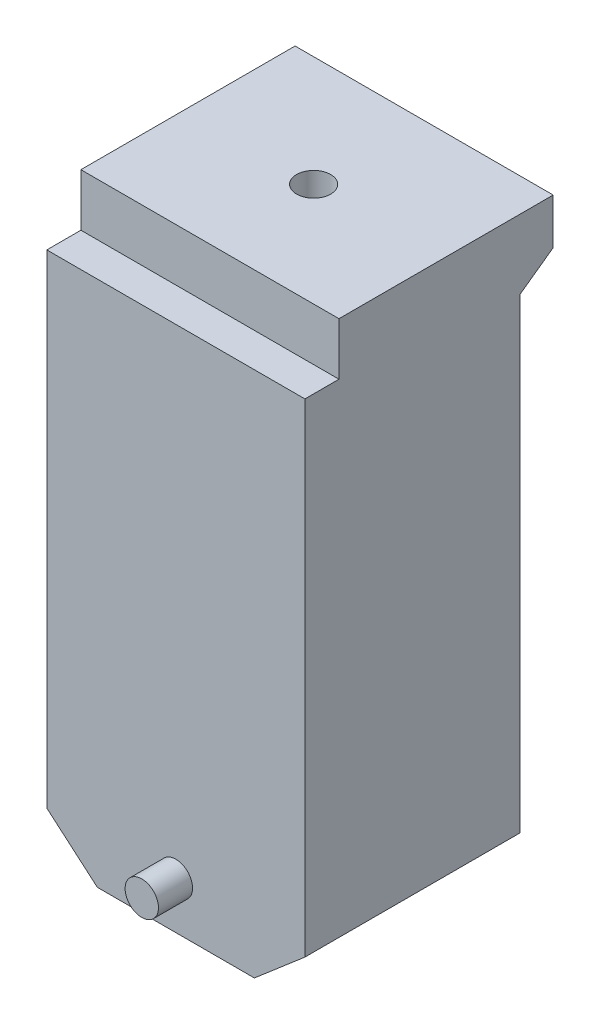
ISO-10303-21;
HEADER;
FILE_DESCRIPTION(('STEP AP214'),'2;1');
FILE_NAME('part.step','',(''),(''),'','','');
FILE_SCHEMA(('AUTOMOTIVE_DESIGN { 1 0 10303 214 1 1 1 1 }'));
ENDSEC;
DATA;
#1=APPLICATION_CONTEXT('core data for automotive mechanical design processes');
#2=APPLICATION_PROTOCOL_DEFINITION('international standard','automotive_design',2000,#1);
#3=PRODUCT_CONTEXT('',#1,'mechanical');
#4=PRODUCT('Part','Part','',(#3));
#5=PRODUCT_RELATED_PRODUCT_CATEGORY('part','',(#4));
#6=PRODUCT_DEFINITION_FORMATION('','',#4);
#7=PRODUCT_DEFINITION_CONTEXT('part definition',#1,'design');
#8=PRODUCT_DEFINITION('design','',#6,#7);
#9=PRODUCT_DEFINITION_SHAPE('','',#8);
#10=(LENGTH_UNIT() NAMED_UNIT(*) SI_UNIT(.MILLI.,.METRE.));
#11=(NAMED_UNIT(*) PLANE_ANGLE_UNIT() SI_UNIT($,.RADIAN.));
#12=(NAMED_UNIT(*) SI_UNIT($,.STERADIAN.) SOLID_ANGLE_UNIT());
#13=UNCERTAINTY_MEASURE_WITH_UNIT(LENGTH_MEASURE(1.E-05),#10,'distance_accuracy_value','');
#14=(GEOMETRIC_REPRESENTATION_CONTEXT(3) GLOBAL_UNCERTAINTY_ASSIGNED_CONTEXT((#13)) GLOBAL_UNIT_ASSIGNED_CONTEXT((#10,
#11,#12)) REPRESENTATION_CONTEXT('',''));
#15=CARTESIAN_POINT('',(0.,0.,0.));
#16=DIRECTION('',(0.,0.,1.));
#17=DIRECTION('',(1.,0.,0.));
#18=AXIS2_PLACEMENT_3D('',#15,#16,#17);
#19=CARTESIAN_POINT('',(75.75,77.1346659907948,-15.5046262952227));
#20=DIRECTION('',(0.,0.,1.));
#21=DIRECTION('',(0.,-1.,0.));
#22=AXIS2_PLACEMENT_3D('',#19,#20,#21);
#23=PLANE('',#22);
#24=CARTESIAN_POINT('',(37.875,-58.7053340092052,-15.5046262952227));
#25=DIRECTION('',(0.,0.,1.));
#26=DIRECTION('',(0.,-1.,0.));
#27=AXIS2_PLACEMENT_3D('',#24,#25,#26);
#28=CIRCLE('',#27,4.9);
#29=CARTESIAN_POINT('',(37.875,-63.6053340092052,-15.5046262952227));
#30=VERTEX_POINT('',#29);
#31=EDGE_CURVE('E192',#30,#30,#28,.T.);
#32=ORIENTED_EDGE('',*,*,#31,.T.);
#33=EDGE_LOOP('',(#32));
#34=FACE_BOUND('',#33,.T.);
#35=DIRECTION('',(0.,1.,0.));
#36=VECTOR('',#35,1.);
#37=CARTESIAN_POINT('',(75.75,77.1346659907948,-15.5046262952227));
#38=LINE('',#37,#36);
#39=CARTESIAN_POINT('',(75.75,-59.7553340092052,-15.5046262952227));
#40=VERTEX_POINT('',#39);
#41=CARTESIAN_POINT('',(75.75,77.1346659907948,-15.5046262952227));
#42=VERTEX_POINT('',#41);
#43=EDGE_CURVE('E132',#40,#42,#38,.T.);
#44=ORIENTED_EDGE('',*,*,#43,.F.);
#45=DIRECTION('',(-0.759039786358374,-0.651044240221073,0.));
#46=VECTOR('',#45,1.);
#47=CARTESIAN_POINT('',(143.396723365083,-1.7333298821753,-15.5046262952227));
#48=LINE('',#47,#46);
#49=CARTESIAN_POINT('',(60.92,-72.4753340092052,-15.5046262952227));
#50=VERTEX_POINT('',#49);
#51=EDGE_CURVE('E48',#40,#50,#48,.T.);
#52=ORIENTED_EDGE('',*,*,#51,.T.);
#53=DIRECTION('',(-1.,0.,0.));
#54=VECTOR('',#53,1.);
#55=CARTESIAN_POINT('',(75.75,-72.4753340092052,-15.5046262952227));
#56=LINE('',#55,#54);
#57=CARTESIAN_POINT('',(14.83,-72.4753340092052,-15.5046262952227));
#58=VERTEX_POINT('',#57);
#59=EDGE_CURVE('E142',#50,#58,#56,.T.);
#60=ORIENTED_EDGE('',*,*,#59,.T.);
#61=DIRECTION('',(-0.759039786358374,0.651044240221073,0.));
#62=VECTOR('',#61,1.);
#63=CARTESIAN_POINT('',(-24.0040125215042,-39.1665923184747,-15.5046262952227));
#64=LINE('',#63,#62);
#65=CARTESIAN_POINT('',(0.,-59.7553340092052,-15.5046262952227));
#66=VERTEX_POINT('',#65);
#67=EDGE_CURVE('E167',#58,#66,#64,.T.);
#68=ORIENTED_EDGE('',*,*,#67,.T.);
#69=DIRECTION('',(0.,1.,0.));
#70=VECTOR('',#69,1.);
#71=CARTESIAN_POINT('',(0.,77.1346659907948,-15.5046262952227));
#72=LINE('',#71,#70);
#73=CARTESIAN_POINT('',(0.,77.1346659907948,-15.5046262952227));
#74=VERTEX_POINT('',#73);
#75=EDGE_CURVE('E165',#66,#74,#72,.T.);
#76=ORIENTED_EDGE('',*,*,#75,.T.);
#77=DIRECTION('',(-1.,0.,0.));
#78=VECTOR('',#77,1.);
#79=CARTESIAN_POINT('',(75.75,77.1346659907948,-15.5046262952227));
#80=LINE('',#79,#78);
#81=EDGE_CURVE('E152',#42,#74,#80,.T.);
#82=ORIENTED_EDGE('',*,*,#81,.F.);
#83=EDGE_LOOP('',(#44,#52,#60,#68,#76,#82));
#84=FACE_BOUND('',#83,.T.);
#85=ADVANCED_FACE('F34',(#34,#84),#23,.F.);
#86=CARTESIAN_POINT('',(75.75,84.1346659907948,-25.2545628489426));
#87=DIRECTION('',(0.,0.812321935637408,0.583209287376578));
#88=DIRECTION('',(0.,-0.583209287376578,0.812321935637407));
#89=AXIS2_PLACEMENT_3D('',#86,#87,#88);
#90=PLANE('',#89);
#91=DIRECTION('',(0.,0.583209287376578,-0.812321935637407));
#92=VECTOR('',#91,1.);
#93=CARTESIAN_POINT('',(0.,84.1346659907948,-25.2545628489426));
#94=LINE('',#93,#92);
#95=CARTESIAN_POINT('',(0.,84.1346659907948,-25.2545628489426));
#96=VERTEX_POINT('',#95);
#97=EDGE_CURVE('E161',#74,#96,#94,.T.);
#98=ORIENTED_EDGE('',*,*,#97,.T.);
#99=DIRECTION('',(-1.,0.,0.));
#100=VECTOR('',#99,1.);
#101=CARTESIAN_POINT('',(75.75,84.1346659907948,-25.2545628489426));
#102=LINE('',#101,#100);
#103=CARTESIAN_POINT('',(75.75,84.1346659907948,-25.2545628489426));
#104=VERTEX_POINT('',#103);
#105=EDGE_CURVE('E149',#104,#96,#102,.T.);
#106=ORIENTED_EDGE('',*,*,#105,.F.);
#107=DIRECTION('',(0.,0.583209287376578,-0.812321935637407));
#108=VECTOR('',#107,1.);
#109=CARTESIAN_POINT('',(75.75,84.1346659907948,-25.2545628489426));
#110=LINE('',#109,#108);
#111=EDGE_CURVE('E135',#42,#104,#110,.T.);
#112=ORIENTED_EDGE('',*,*,#111,.F.);
#113=ORIENTED_EDGE('',*,*,#81,.T.);
#114=EDGE_LOOP('',(#98,#106,#112,#113));
#115=FACE_BOUND('',#114,.T.);
#116=ADVANCED_FACE('F158',(#115),#90,.F.);
#117=CARTESIAN_POINT('',(75.75,97.5246659907948,-25.2545628489426));
#118=DIRECTION('',(0.,0.,1.));
#119=DIRECTION('',(1.,0.,0.));
#120=AXIS2_PLACEMENT_3D('',#117,#118,#119);
#121=PLANE('',#120);
#122=DIRECTION('',(0.,1.,0.));
#123=VECTOR('',#122,1.);
#124=CARTESIAN_POINT('',(0.,97.5246659907948,-25.2545628489426));
#125=LINE('',#124,#123);
#126=CARTESIAN_POINT('',(0.,97.5246659907948,-25.2545628489426));
#127=VERTEX_POINT('',#126);
#128=EDGE_CURVE('E138',#96,#127,#125,.T.);
#129=ORIENTED_EDGE('',*,*,#128,.T.);
#130=DIRECTION('',(-1.,0.,0.));
#131=VECTOR('',#130,1.);
#132=CARTESIAN_POINT('',(75.75,97.5246659907948,-25.2545628489426));
#133=LINE('',#132,#131);
#134=CARTESIAN_POINT('',(75.75,97.5246659907948,-25.2545628489426));
#135=VERTEX_POINT('',#134);
#136=EDGE_CURVE('E146',#135,#127,#133,.T.);
#137=ORIENTED_EDGE('',*,*,#136,.F.);
#138=DIRECTION('',(0.,1.,0.));
#139=VECTOR('',#138,1.);
#140=CARTESIAN_POINT('',(75.75,97.5246659907948,-25.2545628489426));
#141=LINE('',#140,#139);
#142=EDGE_CURVE('E177',#104,#135,#141,.T.);
#143=ORIENTED_EDGE('',*,*,#142,.F.);
#144=ORIENTED_EDGE('',*,*,#105,.T.);
#145=EDGE_LOOP('',(#129,#137,#143,#144));
#146=FACE_BOUND('',#145,.T.);
#147=ADVANCED_FACE('F225',(#146),#121,.F.);
#148=CARTESIAN_POINT('',(75.75,97.5246659907948,39.6153737047773));
#149=DIRECTION('',(0.,-1.,0.));
#150=DIRECTION('',(0.,0.,-1.));
#151=AXIS2_PLACEMENT_3D('',#148,#149,#150);
#152=PLANE('',#151);
#153=CARTESIAN_POINT('',(37.875,97.5246659907948,7.18040542791732));
#154=DIRECTION('',(0.,1.,0.));
#155=DIRECTION('',(0.,0.,1.));
#156=AXIS2_PLACEMENT_3D('',#153,#154,#155);
#157=CIRCLE('',#156,5.);
#158=CARTESIAN_POINT('',(37.875,97.5246659907948,12.1804054279173));
#159=VERTEX_POINT('',#158);
#160=EDGE_CURVE('E202',#159,#159,#157,.T.);
#161=ORIENTED_EDGE('',*,*,#160,.F.);
#162=EDGE_LOOP('',(#161));
#163=FACE_BOUND('',#162,.T.);
#164=DIRECTION('',(0.,0.,1.));
#165=VECTOR('',#164,1.);
#166=CARTESIAN_POINT('',(0.,97.5246659907948,39.6153737047773));
#167=LINE('',#166,#165);
#168=CARTESIAN_POINT('',(0.,97.5246659907948,37.6153737047773));
#169=VERTEX_POINT('',#168);
#170=EDGE_CURVE('E133',#127,#169,#167,.T.);
#171=ORIENTED_EDGE('',*,*,#170,.T.);
#172=DIRECTION('',(1.,0.,0.));
#173=VECTOR('',#172,1.);
#174=CARTESIAN_POINT('',(0.,97.5246659907948,37.6153737047773));
#175=LINE('',#174,#173);
#176=CARTESIAN_POINT('',(75.75,97.5246659907948,37.6153737047773));
#177=VERTEX_POINT('',#176);
#178=EDGE_CURVE('E205',#169,#177,#175,.T.);
#179=ORIENTED_EDGE('',*,*,#178,.T.);
#180=DIRECTION('',(0.,0.,1.));
#181=VECTOR('',#180,1.);
#182=CARTESIAN_POINT('',(75.75,97.5246659907948,-15.5046262952227));
#183=LINE('',#182,#181);
#184=EDGE_CURVE('E174',#135,#177,#183,.T.);
#185=ORIENTED_EDGE('',*,*,#184,.F.);
#186=ORIENTED_EDGE('',*,*,#136,.T.);
#187=EDGE_LOOP('',(#171,#179,#185,#186));
#188=FACE_BOUND('',#187,.T.);
#189=ADVANCED_FACE('F221',(#163,#188),#152,.F.);
#190=CARTESIAN_POINT('',(75.75,84.1346659907948,47.6153737047773));
#191=DIRECTION('',(0.,0.,-1.));
#192=DIRECTION('',(0.,1.,0.));
#193=AXIS2_PLACEMENT_3D('',#190,#191,#192);
#194=PLANE('',#193);
#195=CARTESIAN_POINT('',(37.875,-58.7053340092052,47.6153737047773));
#196=DIRECTION('',(0.,0.,-1.));
#197=DIRECTION('',(0.,1.,0.));
#198=AXIS2_PLACEMENT_3D('',#195,#196,#197);
#199=CIRCLE('',#198,4.9);
#200=CARTESIAN_POINT('',(37.875,-53.8053340092052,47.6153737047773));
#201=VERTEX_POINT('',#200);
#202=EDGE_CURVE('E37',#201,#201,#199,.T.);
#203=ORIENTED_EDGE('',*,*,#202,.T.);
#204=EDGE_LOOP('',(#203));
#205=FACE_BOUND('',#204,.T.);
#206=DIRECTION('',(0.,-1.,0.));
#207=VECTOR('',#206,1.);
#208=CARTESIAN_POINT('',(75.75,84.1346659907948,47.6153737047773));
#209=LINE('',#208,#207);
#210=CARTESIAN_POINT('',(75.75,82.1346659907948,47.6153737047773));
#211=VERTEX_POINT('',#210);
#212=CARTESIAN_POINT('',(75.75,-59.7553340092052,47.6153737047773));
#213=VERTEX_POINT('',#212);
#214=EDGE_CURVE('E127',#211,#213,#209,.T.);
#215=ORIENTED_EDGE('',*,*,#214,.F.);
#216=DIRECTION('',(1.,0.,0.));
#217=VECTOR('',#216,1.);
#218=CARTESIAN_POINT('',(0.,82.1346659907948,47.6153737047773));
#219=LINE('',#218,#217);
#220=CARTESIAN_POINT('',(0.,82.1346659907948,47.6153737047773));
#221=VERTEX_POINT('',#220);
#222=EDGE_CURVE('E116',#221,#211,#219,.T.);
#223=ORIENTED_EDGE('',*,*,#222,.F.);
#224=DIRECTION('',(0.,-1.,0.));
#225=VECTOR('',#224,1.);
#226=CARTESIAN_POINT('',(0.,84.1346659907948,47.6153737047773));
#227=LINE('',#226,#225);
#228=CARTESIAN_POINT('',(0.,-59.7553340092052,47.6153737047773));
#229=VERTEX_POINT('',#228);
#230=EDGE_CURVE('E56',#221,#229,#227,.T.);
#231=ORIENTED_EDGE('',*,*,#230,.T.);
#232=DIRECTION('',(-0.759039786358374,0.651044240221073,0.));
#233=VECTOR('',#232,1.);
#234=CARTESIAN_POINT('',(0.,-59.7553340092052,47.6153737047773));
#235=LINE('',#234,#233);
#236=CARTESIAN_POINT('',(14.83,-72.4753340092052,47.6153737047773));
#237=VERTEX_POINT('',#236);
#238=EDGE_CURVE('E184',#237,#229,#235,.T.);
#239=ORIENTED_EDGE('',*,*,#238,.F.);
#240=DIRECTION('',(-1.,0.,0.));
#241=VECTOR('',#240,1.);
#242=CARTESIAN_POINT('',(75.75,-72.4753340092052,47.6153737047773));
#243=LINE('',#242,#241);
#244=CARTESIAN_POINT('',(60.92,-72.4753340092052,47.6153737047773));
#245=VERTEX_POINT('',#244);
#246=EDGE_CURVE('E144',#245,#237,#243,.T.);
#247=ORIENTED_EDGE('',*,*,#246,.F.);
#248=DIRECTION('',(-0.759039786358374,-0.651044240221073,0.));
#249=VECTOR('',#248,1.);
#250=CARTESIAN_POINT('',(75.75,-59.7553340092052,47.6153737047773));
#251=LINE('',#250,#249);
#252=EDGE_CURVE('E190',#213,#245,#251,.T.);
#253=ORIENTED_EDGE('',*,*,#252,.F.);
#254=EDGE_LOOP('',(#215,#223,#231,#239,#247,#253));
#255=FACE_BOUND('',#254,.T.);
#256=ADVANCED_FACE('F125',(#205,#255),#194,.F.);
#257=CARTESIAN_POINT('',(75.75,-72.4753340092052,47.6153737047773));
#258=DIRECTION('',(0.,1.,0.));
#259=DIRECTION('',(0.,0.,1.));
#260=AXIS2_PLACEMENT_3D('',#257,#258,#259);
#261=PLANE('',#260);
#262=ORIENTED_EDGE('',*,*,#59,.F.);
#263=DIRECTION('',(0.,0.,1.));
#264=VECTOR('',#263,1.);
#265=CARTESIAN_POINT('',(60.92,-72.4753340092052,-25.2545628489426));
#266=LINE('',#265,#264);
#267=EDGE_CURVE('E187',#50,#245,#266,.T.);
#268=ORIENTED_EDGE('',*,*,#267,.T.);
#269=ORIENTED_EDGE('',*,*,#246,.T.);
#270=DIRECTION('',(0.,0.,1.));
#271=VECTOR('',#270,1.);
#272=CARTESIAN_POINT('',(14.83,-72.4753340092052,-25.2545628489426));
#273=LINE('',#272,#271);
#274=EDGE_CURVE('E181',#58,#237,#273,.T.);
#275=ORIENTED_EDGE('',*,*,#274,.F.);
#276=EDGE_LOOP('',(#262,#268,#269,#275));
#277=FACE_BOUND('',#276,.T.);
#278=ADVANCED_FACE('F231',(#277),#261,.F.);
#279=CARTESIAN_POINT('',(75.75,0.,0.));
#280=DIRECTION('',(1.,0.,0.));
#281=DIRECTION('',(0.,0.,-1.));
#282=AXIS2_PLACEMENT_3D('',#279,#280,#281);
#283=PLANE('',#282);
#284=DIRECTION('',(0.,1.,0.));
#285=VECTOR('',#284,1.);
#286=CARTESIAN_POINT('',(75.75,97.5246659907948,37.6153737047773));
#287=LINE('',#286,#285);
#288=CARTESIAN_POINT('',(75.75,82.1346659907948,37.6153737047773));
#289=VERTEX_POINT('',#288);
#290=EDGE_CURVE('E211',#289,#177,#287,.T.);
#291=ORIENTED_EDGE('',*,*,#290,.F.);
#292=DIRECTION('',(0.,0.,-1.));
#293=VECTOR('',#292,1.);
#294=CARTESIAN_POINT('',(75.75,82.1346659907948,47.6153737047773));
#295=LINE('',#294,#293);
#296=EDGE_CURVE('E122',#211,#289,#295,.T.);
#297=ORIENTED_EDGE('',*,*,#296,.F.);
#298=ORIENTED_EDGE('',*,*,#214,.T.);
#299=DIRECTION('',(0.,0.,1.));
#300=VECTOR('',#299,1.);
#301=CARTESIAN_POINT('',(75.75,-59.7553340092052,0.));
#302=LINE('',#301,#300);
#303=EDGE_CURVE('E11',#40,#213,#302,.T.);
#304=ORIENTED_EDGE('',*,*,#303,.F.);
#305=ORIENTED_EDGE('',*,*,#43,.T.);
#306=ORIENTED_EDGE('',*,*,#111,.T.);
#307=ORIENTED_EDGE('',*,*,#142,.T.);
#308=ORIENTED_EDGE('',*,*,#184,.T.);
#309=EDGE_LOOP('',(#291,#297,#298,#304,#305,#306,#307,#308));
#310=FACE_BOUND('',#309,.T.);
#311=ADVANCED_FACE('F216',(#310),#283,.T.);
#312=CARTESIAN_POINT('',(0.,0.,0.));
#313=DIRECTION('',(1.,0.,0.));
#314=DIRECTION('',(0.,0.,-1.));
#315=AXIS2_PLACEMENT_3D('',#312,#313,#314);
#316=PLANE('',#315);
#317=DIRECTION('',(0.,0.,-1.));
#318=VECTOR('',#317,1.);
#319=CARTESIAN_POINT('',(0.,82.1346659907948,47.6153737047773));
#320=LINE('',#319,#318);
#321=CARTESIAN_POINT('',(0.,82.1346659907948,37.6153737047773));
#322=VERTEX_POINT('',#321);
#323=EDGE_CURVE('E113',#221,#322,#320,.T.);
#324=ORIENTED_EDGE('',*,*,#323,.T.);
#325=DIRECTION('',(0.,1.,0.));
#326=VECTOR('',#325,1.);
#327=CARTESIAN_POINT('',(0.,97.5246659907948,37.6153737047773));
#328=LINE('',#327,#326);
#329=EDGE_CURVE('E210',#322,#169,#328,.T.);
#330=ORIENTED_EDGE('',*,*,#329,.T.);
#331=ORIENTED_EDGE('',*,*,#170,.F.);
#332=ORIENTED_EDGE('',*,*,#128,.F.);
#333=ORIENTED_EDGE('',*,*,#97,.F.);
#334=ORIENTED_EDGE('',*,*,#75,.F.);
#335=DIRECTION('',(0.,0.,1.));
#336=VECTOR('',#335,1.);
#337=CARTESIAN_POINT('',(0.,-59.7553340092052,0.));
#338=LINE('',#337,#336);
#339=EDGE_CURVE('E42',#66,#229,#338,.T.);
#340=ORIENTED_EDGE('',*,*,#339,.T.);
#341=ORIENTED_EDGE('',*,*,#230,.F.);
#342=EDGE_LOOP('',(#324,#330,#331,#332,#333,#334,#340,#341));
#343=FACE_BOUND('',#342,.T.);
#344=ADVANCED_FACE('F130',(#343),#316,.F.);
#345=CARTESIAN_POINT('',(0.,-59.7553340092052,-25.2545628489426));
#346=DIRECTION('',(0.651044240221073,0.759039786358374,0.));
#347=DIRECTION('',(-0.759039786358374,0.651044240221073,0.));
#348=AXIS2_PLACEMENT_3D('',#345,#346,#347);
#349=PLANE('',#348);
#350=ORIENTED_EDGE('',*,*,#274,.T.);
#351=ORIENTED_EDGE('',*,*,#238,.T.);
#352=ORIENTED_EDGE('',*,*,#339,.F.);
#353=ORIENTED_EDGE('',*,*,#67,.F.);
#354=EDGE_LOOP('',(#350,#351,#352,#353));
#355=FACE_BOUND('',#354,.T.);
#356=ADVANCED_FACE('F233',(#355),#349,.F.);
#357=CARTESIAN_POINT('',(75.75,-59.7553340092052,-25.2545628489426));
#358=DIRECTION('',(-0.651044240221073,0.759039786358374,0.));
#359=DIRECTION('',(-0.759039786358374,-0.651044240221073,0.));
#360=AXIS2_PLACEMENT_3D('',#357,#358,#359);
#361=PLANE('',#360);
#362=ORIENTED_EDGE('',*,*,#303,.T.);
#363=ORIENTED_EDGE('',*,*,#252,.T.);
#364=ORIENTED_EDGE('',*,*,#267,.F.);
#365=ORIENTED_EDGE('',*,*,#51,.F.);
#366=EDGE_LOOP('',(#362,#363,#364,#365));
#367=FACE_BOUND('',#366,.T.);
#368=ADVANCED_FACE('F226',(#367),#361,.F.);
#369=CARTESIAN_POINT('',(37.875,-58.7053340092052,57.6153737047773));
#370=DIRECTION('',(0.,0.,1.));
#371=DIRECTION('',(1.,0.,0.));
#372=AXIS2_PLACEMENT_3D('',#369,#370,#371);
#373=PLANE('',#372);
#374=CARTESIAN_POINT('',(37.875,-58.7053340092052,57.6153737047773));
#375=DIRECTION('',(0.,0.,1.));
#376=DIRECTION('',(1.,0.,0.));
#377=AXIS2_PLACEMENT_3D('',#374,#375,#376);
#378=CIRCLE('',#377,4.9);
#379=CARTESIAN_POINT('',(42.775,-58.7053340092052,57.6153737047773));
#380=VERTEX_POINT('',#379);
#381=EDGE_CURVE('E198',#380,#380,#378,.T.);
#382=ORIENTED_EDGE('',*,*,#381,.T.);
#383=EDGE_LOOP('',(#382));
#384=FACE_BOUND('',#383,.T.);
#385=ADVANCED_FACE('F240',(#384),#373,.T.);
#386=CARTESIAN_POINT('',(37.875,-58.7053340092052,-25.5046262952227));
#387=DIRECTION('',(0.,0.,1.));
#388=DIRECTION('',(1.,0.,0.));
#389=AXIS2_PLACEMENT_3D('',#386,#387,#388);
#390=CYLINDRICAL_SURFACE('',#389,4.9);
#391=ORIENTED_EDGE('',*,*,#381,.F.);
#392=EDGE_LOOP('',(#391));
#393=FACE_BOUND('',#392,.T.);
#394=ORIENTED_EDGE('',*,*,#202,.F.);
#395=EDGE_LOOP('',(#394));
#396=FACE_BOUND('',#395,.T.);
#397=ADVANCED_FACE('F254',(#393,#396),#390,.T.);
#398=CARTESIAN_POINT('',(37.875,-58.7053340092052,-25.5046262952227));
#399=DIRECTION('',(0.,0.,1.));
#400=DIRECTION('',(1.,0.,0.));
#401=AXIS2_PLACEMENT_3D('',#398,#399,#400);
#402=CIRCLE('',#401,4.9);
#403=CARTESIAN_POINT('',(42.775,-58.7053340092052,-25.5046262952227));
#404=VERTEX_POINT('',#403);
#405=EDGE_CURVE('E195',#404,#404,#402,.T.);
#406=ORIENTED_EDGE('',*,*,#405,.T.);
#407=EDGE_LOOP('',(#406));
#408=FACE_BOUND('',#407,.T.);
#409=ORIENTED_EDGE('',*,*,#31,.F.);
#410=EDGE_LOOP('',(#409));
#411=FACE_BOUND('',#410,.T.);
#412=ADVANCED_FACE('F251',(#408,#411),#390,.T.);
#413=CARTESIAN_POINT('',(37.875,-58.7053340092052,-25.5046262952227));
#414=DIRECTION('',(0.,0.,1.));
#415=DIRECTION('',(1.,0.,0.));
#416=AXIS2_PLACEMENT_3D('',#413,#414,#415);
#417=PLANE('',#416);
#418=ORIENTED_EDGE('',*,*,#405,.F.);
#419=EDGE_LOOP('',(#418));
#420=FACE_BOUND('',#419,.T.);
#421=ADVANCED_FACE('F253',(#420),#417,.F.);
#422=CARTESIAN_POINT('',(37.875,87.5246659907948,7.18040542791732));
#423=DIRECTION('',(0.,1.,0.));
#424=DIRECTION('',(0.,0.,1.));
#425=AXIS2_PLACEMENT_3D('',#422,#423,#424);
#426=CYLINDRICAL_SURFACE('',#425,5.);
#427=CARTESIAN_POINT('',(37.875,87.5246659907948,7.18040542791732));
#428=DIRECTION('',(0.,1.,0.));
#429=DIRECTION('',(0.,0.,1.));
#430=AXIS2_PLACEMENT_3D('',#427,#428,#429);
#431=CIRCLE('',#430,5.);
#432=CARTESIAN_POINT('',(37.875,87.5246659907948,12.1804054279173));
#433=VERTEX_POINT('',#432);
#434=EDGE_CURVE('E201',#433,#433,#431,.T.);
#435=ORIENTED_EDGE('',*,*,#434,.F.);
#436=EDGE_LOOP('',(#435));
#437=FACE_BOUND('',#436,.T.);
#438=ORIENTED_EDGE('',*,*,#160,.T.);
#439=EDGE_LOOP('',(#438));
#440=FACE_BOUND('',#439,.T.);
#441=ADVANCED_FACE('F261',(#437,#440),#426,.F.);
#442=CARTESIAN_POINT('',(37.875,87.5246659907948,7.18040542791732));
#443=DIRECTION('',(0.,1.,0.));
#444=DIRECTION('',(0.,0.,1.));
#445=AXIS2_PLACEMENT_3D('',#442,#443,#444);
#446=PLANE('',#445);
#447=ORIENTED_EDGE('',*,*,#434,.T.);
#448=EDGE_LOOP('',(#447));
#449=FACE_BOUND('',#448,.T.);
#450=ADVANCED_FACE('F271',(#449),#446,.T.);
#451=CARTESIAN_POINT('',(0.,97.5246659907948,37.6153737047773));
#452=DIRECTION('',(0.,0.,-1.));
#453=DIRECTION('',(-1.,0.,0.));
#454=AXIS2_PLACEMENT_3D('',#451,#452,#453);
#455=PLANE('',#454);
#456=ORIENTED_EDGE('',*,*,#290,.T.);
#457=ORIENTED_EDGE('',*,*,#178,.F.);
#458=ORIENTED_EDGE('',*,*,#329,.F.);
#459=DIRECTION('',(1.,0.,0.));
#460=VECTOR('',#459,1.);
#461=CARTESIAN_POINT('',(0.,82.1346659907948,37.6153737047773));
#462=LINE('',#461,#460);
#463=EDGE_CURVE('E119',#322,#289,#462,.T.);
#464=ORIENTED_EDGE('',*,*,#463,.T.);
#465=EDGE_LOOP('',(#456,#457,#458,#464));
#466=FACE_BOUND('',#465,.T.);
#467=ADVANCED_FACE('F219',(#466),#455,.F.);
#468=CARTESIAN_POINT('',(0.,82.1346659907948,47.6153737047773));
#469=DIRECTION('',(0.,-1.,0.));
#470=DIRECTION('',(0.,0.,-1.));
#471=AXIS2_PLACEMENT_3D('',#468,#469,#470);
#472=PLANE('',#471);
#473=ORIENTED_EDGE('',*,*,#296,.T.);
#474=ORIENTED_EDGE('',*,*,#463,.F.);
#475=ORIENTED_EDGE('',*,*,#323,.F.);
#476=ORIENTED_EDGE('',*,*,#222,.T.);
#477=EDGE_LOOP('',(#473,#474,#475,#476));
#478=FACE_BOUND('',#477,.T.);
#479=ADVANCED_FACE('F115',(#478),#472,.F.);
#480=CLOSED_SHELL('',(#85,#116,#147,#189,#256,#278,#311,#344,#356,#368,#385,#397,#412,#421,#441,
#450,#467,#479));
#481=MANIFOLD_SOLID_BREP('B2',#480);
#482=ADVANCED_BREP_SHAPE_REPRESENTATION('',(#18,#481),#14);
#483=SHAPE_DEFINITION_REPRESENTATION(#9,#482);
ENDSEC;
END-ISO-10303-21;
